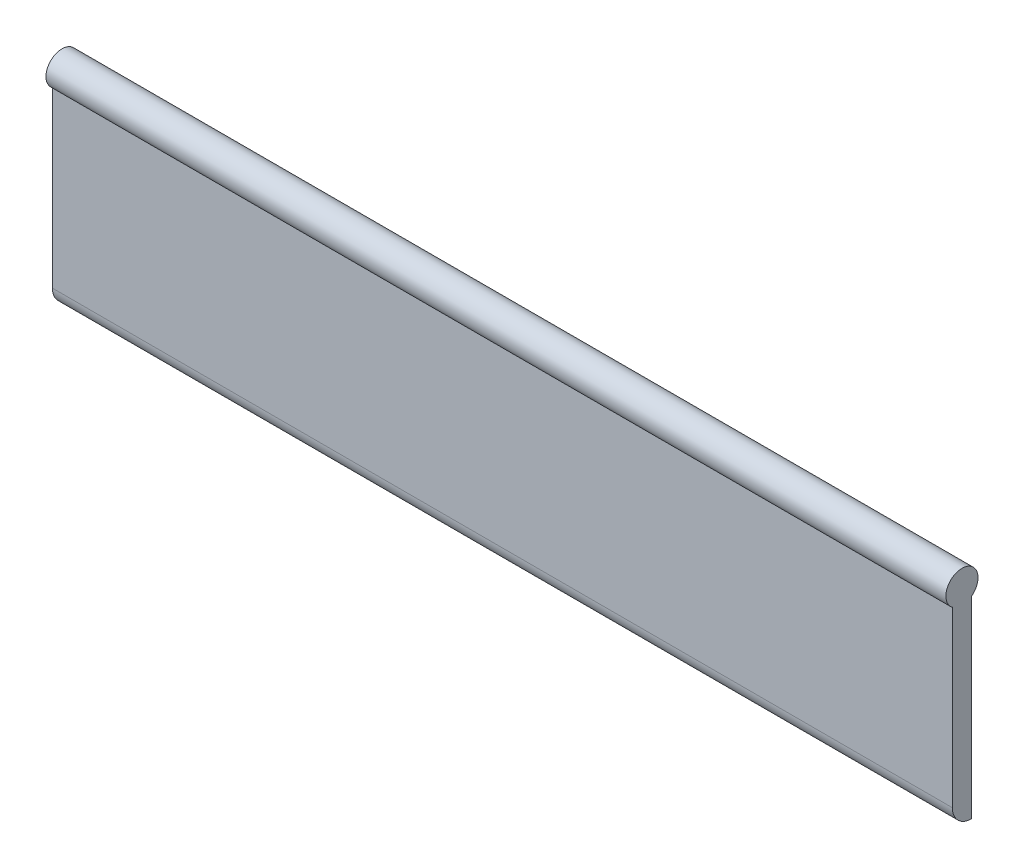
ISO-10303-21;
HEADER;
FILE_DESCRIPTION(('STEP AP214'),'2;1');
FILE_NAME('part.step','',(''),(''),'','','');
FILE_SCHEMA(('AUTOMOTIVE_DESIGN { 1 0 10303 214 1 1 1 1 }'));
ENDSEC;
DATA;
#1=APPLICATION_CONTEXT('core data for automotive mechanical design processes');
#2=APPLICATION_PROTOCOL_DEFINITION('international standard','automotive_design',2000,#1);
#3=PRODUCT_CONTEXT('',#1,'mechanical');
#4=PRODUCT('Part','Part','',(#3));
#5=PRODUCT_RELATED_PRODUCT_CATEGORY('part','',(#4));
#6=PRODUCT_DEFINITION_FORMATION('','',#4);
#7=PRODUCT_DEFINITION_CONTEXT('part definition',#1,'design');
#8=PRODUCT_DEFINITION('design','',#6,#7);
#9=PRODUCT_DEFINITION_SHAPE('','',#8);
#10=(LENGTH_UNIT() NAMED_UNIT(*) SI_UNIT(.MILLI.,.METRE.));
#11=(NAMED_UNIT(*) PLANE_ANGLE_UNIT() SI_UNIT($,.RADIAN.));
#12=(NAMED_UNIT(*) SI_UNIT($,.STERADIAN.) SOLID_ANGLE_UNIT());
#13=UNCERTAINTY_MEASURE_WITH_UNIT(LENGTH_MEASURE(1.E-05),#10,'distance_accuracy_value','');
#14=(GEOMETRIC_REPRESENTATION_CONTEXT(3) GLOBAL_UNCERTAINTY_ASSIGNED_CONTEXT((#13)) GLOBAL_UNIT_ASSIGNED_CONTEXT((#10,
#11,#12)) REPRESENTATION_CONTEXT('',''));
#15=CARTESIAN_POINT('',(0.,0.,0.));
#16=DIRECTION('',(0.,0.,1.));
#17=DIRECTION('',(1.,0.,0.));
#18=AXIS2_PLACEMENT_3D('',#15,#16,#17);
#19=CARTESIAN_POINT('',(140.,32.,-1.5));
#20=DIRECTION('',(-1.,0.,0.));
#21=DIRECTION('',(0.,0.,1.));
#22=AXIS2_PLACEMENT_3D('',#19,#20,#21);
#23=CYLINDRICAL_SURFACE('',#22,2.5);
#24=CARTESIAN_POINT('',(0.,32.,-1.5));
#25=DIRECTION('',(1.,0.,0.));
#26=DIRECTION('',(0.,0.,-1.));
#27=AXIS2_PLACEMENT_3D('',#24,#25,#26);
#28=CIRCLE('',#27,2.5);
#29=CARTESIAN_POINT('',(0.,30.,-3.));
#30=VERTEX_POINT('',#29);
#31=CARTESIAN_POINT('',(0.,30.,0.));
#32=VERTEX_POINT('',#31);
#33=EDGE_CURVE('E112',#30,#32,#28,.T.);
#34=ORIENTED_EDGE('',*,*,#33,.T.);
#35=DIRECTION('',(-1.,0.,0.));
#36=VECTOR('',#35,1.);
#37=CARTESIAN_POINT('',(140.,30.,0.));
#38=LINE('',#37,#36);
#39=CARTESIAN_POINT('',(140.,30.,0.));
#40=VERTEX_POINT('',#39);
#41=EDGE_CURVE('E11',#40,#32,#38,.T.);
#42=ORIENTED_EDGE('',*,*,#41,.F.);
#43=CARTESIAN_POINT('',(140.,32.,-1.5));
#44=DIRECTION('',(1.,0.,0.));
#45=DIRECTION('',(0.,0.,-1.));
#46=AXIS2_PLACEMENT_3D('',#43,#44,#45);
#47=CIRCLE('',#46,2.5);
#48=CARTESIAN_POINT('',(140.,30.,-3.));
#49=VERTEX_POINT('',#48);
#50=EDGE_CURVE('E85',#49,#40,#47,.T.);
#51=ORIENTED_EDGE('',*,*,#50,.F.);
#52=DIRECTION('',(-1.,0.,0.));
#53=VECTOR('',#52,1.);
#54=CARTESIAN_POINT('',(140.,30.,-3.));
#55=LINE('',#54,#53);
#56=EDGE_CURVE('E108',#49,#30,#55,.T.);
#57=ORIENTED_EDGE('',*,*,#56,.T.);
#58=EDGE_LOOP('',(#34,#42,#51,#57));
#59=FACE_BOUND('',#58,.T.);
#60=ADVANCED_FACE('F45',(#59),#23,.T.);
#61=CARTESIAN_POINT('',(140.,0.,0.));
#62=DIRECTION('',(0.,0.,1.));
#63=DIRECTION('',(1.,0.,0.));
#64=AXIS2_PLACEMENT_3D('',#61,#62,#63);
#65=PLANE('',#64);
#66=DIRECTION('',(0.,1.,0.));
#67=VECTOR('',#66,1.);
#68=CARTESIAN_POINT('',(0.,0.,0.));
#69=LINE('',#68,#67);
#70=CARTESIAN_POINT('',(0.,3.,0.));
#71=VERTEX_POINT('',#70);
#72=EDGE_CURVE('E94',#71,#32,#69,.T.);
#73=ORIENTED_EDGE('',*,*,#72,.F.);
#74=DIRECTION('',(-1.,0.,0.));
#75=VECTOR('',#74,1.);
#76=CARTESIAN_POINT('',(140.,3.,0.));
#77=LINE('',#76,#75);
#78=CARTESIAN_POINT('',(140.,3.,0.));
#79=VERTEX_POINT('',#78);
#80=EDGE_CURVE('E54',#79,#71,#77,.T.);
#81=ORIENTED_EDGE('',*,*,#80,.F.);
#82=DIRECTION('',(0.,1.,0.));
#83=VECTOR('',#82,1.);
#84=CARTESIAN_POINT('',(140.,0.,0.));
#85=LINE('',#84,#83);
#86=EDGE_CURVE('E92',#79,#40,#85,.T.);
#87=ORIENTED_EDGE('',*,*,#86,.T.);
#88=ORIENTED_EDGE('',*,*,#41,.T.);
#89=EDGE_LOOP('',(#73,#81,#87,#88));
#90=FACE_BOUND('',#89,.T.);
#91=ADVANCED_FACE('F91',(#90),#65,.T.);
#92=CARTESIAN_POINT('',(140.,3.,-3.));
#93=DIRECTION('',(-1.,0.,0.));
#94=DIRECTION('',(0.,0.,1.));
#95=AXIS2_PLACEMENT_3D('',#92,#93,#94);
#96=CYLINDRICAL_SURFACE('',#95,3.);
#97=CARTESIAN_POINT('',(0.,3.,-3.));
#98=DIRECTION('',(1.,0.,0.));
#99=DIRECTION('',(0.,0.,-1.));
#100=AXIS2_PLACEMENT_3D('',#97,#98,#99);
#101=CIRCLE('',#100,3.);
#102=CARTESIAN_POINT('',(0.,0.,-3.));
#103=VERTEX_POINT('',#102);
#104=EDGE_CURVE('E118',#103,#71,#101,.F.);
#105=ORIENTED_EDGE('',*,*,#104,.F.);
#106=DIRECTION('',(-1.,0.,0.));
#107=VECTOR('',#106,1.);
#108=CARTESIAN_POINT('',(140.,0.,-3.));
#109=LINE('',#108,#107);
#110=CARTESIAN_POINT('',(140.,0.,-3.));
#111=VERTEX_POINT('',#110);
#112=EDGE_CURVE('E77',#111,#103,#109,.T.);
#113=ORIENTED_EDGE('',*,*,#112,.F.);
#114=CARTESIAN_POINT('',(140.,3.,-3.));
#115=DIRECTION('',(1.,0.,0.));
#116=DIRECTION('',(0.,0.,-1.));
#117=AXIS2_PLACEMENT_3D('',#114,#115,#116);
#118=CIRCLE('',#117,3.);
#119=EDGE_CURVE('E101',#111,#79,#118,.F.);
#120=ORIENTED_EDGE('',*,*,#119,.T.);
#121=ORIENTED_EDGE('',*,*,#80,.T.);
#122=EDGE_LOOP('',(#105,#113,#120,#121));
#123=FACE_BOUND('',#122,.T.);
#124=ADVANCED_FACE('F104',(#123),#96,.T.);
#125=CARTESIAN_POINT('',(140.,0.,-3.));
#126=DIRECTION('',(0.,0.,1.));
#127=DIRECTION('',(1.,0.,0.));
#128=AXIS2_PLACEMENT_3D('',#125,#126,#127);
#129=PLANE('',#128);
#130=DIRECTION('',(0.,1.,0.));
#131=VECTOR('',#130,1.);
#132=CARTESIAN_POINT('',(0.,0.,-3.));
#133=LINE('',#132,#131);
#134=EDGE_CURVE('E80',#103,#30,#133,.T.);
#135=ORIENTED_EDGE('',*,*,#134,.T.);
#136=ORIENTED_EDGE('',*,*,#56,.F.);
#137=DIRECTION('',(0.,1.,0.));
#138=VECTOR('',#137,1.);
#139=CARTESIAN_POINT('',(140.,0.,-3.));
#140=LINE('',#139,#138);
#141=EDGE_CURVE('E62',#111,#49,#140,.T.);
#142=ORIENTED_EDGE('',*,*,#141,.F.);
#143=ORIENTED_EDGE('',*,*,#112,.T.);
#144=EDGE_LOOP('',(#135,#136,#142,#143));
#145=FACE_BOUND('',#144,.T.);
#146=ADVANCED_FACE('F135',(#145),#129,.F.);
#147=CARTESIAN_POINT('',(140.,0.,0.));
#148=DIRECTION('',(1.,0.,0.));
#149=DIRECTION('',(0.,0.,-1.));
#150=AXIS2_PLACEMENT_3D('',#147,#148,#149);
#151=PLANE('',#150);
#152=ORIENTED_EDGE('',*,*,#50,.T.);
#153=ORIENTED_EDGE('',*,*,#86,.F.);
#154=ORIENTED_EDGE('',*,*,#119,.F.);
#155=ORIENTED_EDGE('',*,*,#141,.T.);
#156=EDGE_LOOP('',(#152,#153,#154,#155));
#157=FACE_BOUND('',#156,.T.);
#158=ADVANCED_FACE('F100',(#157),#151,.T.);
#159=CARTESIAN_POINT('',(0.,0.,0.));
#160=DIRECTION('',(1.,0.,0.));
#161=DIRECTION('',(0.,0.,-1.));
#162=AXIS2_PLACEMENT_3D('',#159,#160,#161);
#163=PLANE('',#162);
#164=ORIENTED_EDGE('',*,*,#33,.F.);
#165=ORIENTED_EDGE('',*,*,#134,.F.);
#166=ORIENTED_EDGE('',*,*,#104,.T.);
#167=ORIENTED_EDGE('',*,*,#72,.T.);
#168=EDGE_LOOP('',(#164,#165,#166,#167));
#169=FACE_BOUND('',#168,.T.);
#170=ADVANCED_FACE('F129',(#169),#163,.F.);
#171=CLOSED_SHELL('',(#60,#91,#124,#146,#158,#170));
#172=MANIFOLD_SOLID_BREP('B2',#171);
#173=ADVANCED_BREP_SHAPE_REPRESENTATION('',(#18,#172),#14);
#174=SHAPE_DEFINITION_REPRESENTATION(#9,#173);
ENDSEC;
END-ISO-10303-21;
